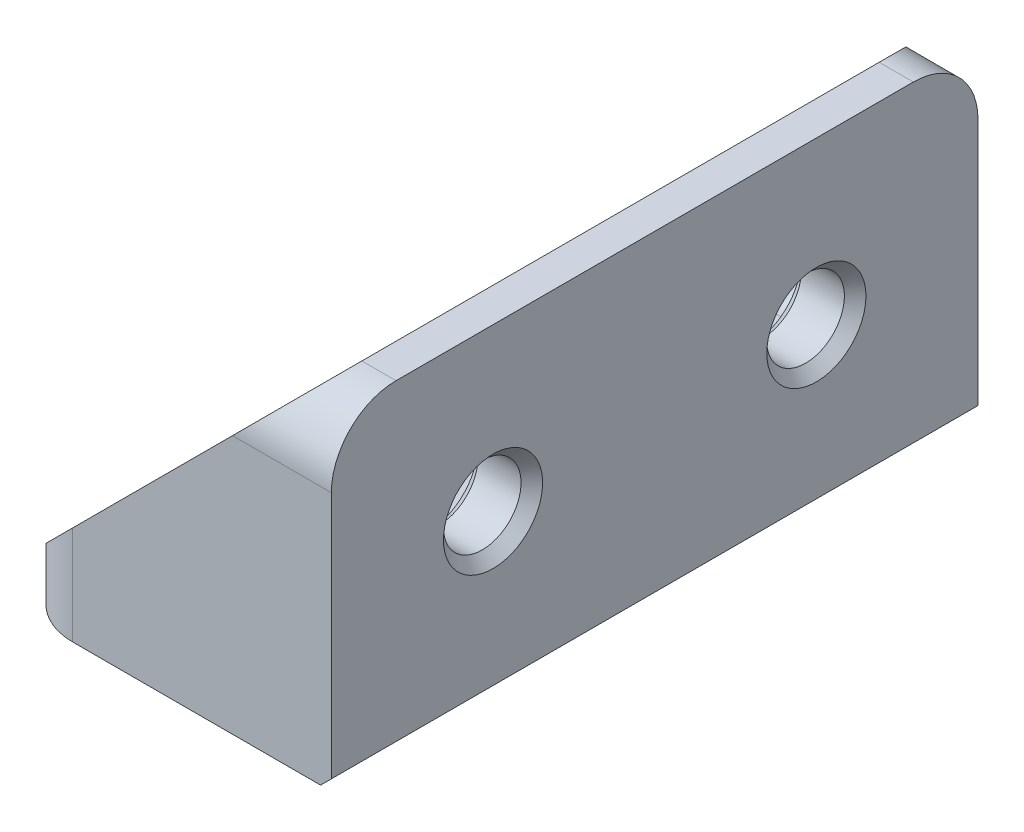
ISO-10303-21;
HEADER;
FILE_DESCRIPTION(('STEP AP214'),'2;1');
FILE_NAME('part.step','',(''),(''),'','','');
FILE_SCHEMA(('AUTOMOTIVE_DESIGN { 1 0 10303 214 1 1 1 1 }'));
ENDSEC;
DATA;
#1=APPLICATION_CONTEXT('core data for automotive mechanical design processes');
#2=APPLICATION_PROTOCOL_DEFINITION('international standard','automotive_design',2000,#1);
#3=PRODUCT_CONTEXT('',#1,'mechanical');
#4=PRODUCT('Part','Part','',(#3));
#5=PRODUCT_RELATED_PRODUCT_CATEGORY('part','',(#4));
#6=PRODUCT_DEFINITION_FORMATION('','',#4);
#7=PRODUCT_DEFINITION_CONTEXT('part definition',#1,'design');
#8=PRODUCT_DEFINITION('design','',#6,#7);
#9=PRODUCT_DEFINITION_SHAPE('','',#8);
#10=(LENGTH_UNIT() NAMED_UNIT(*) SI_UNIT(.MILLI.,.METRE.));
#11=(NAMED_UNIT(*) PLANE_ANGLE_UNIT() SI_UNIT($,.RADIAN.));
#12=(NAMED_UNIT(*) SI_UNIT($,.STERADIAN.) SOLID_ANGLE_UNIT());
#13=UNCERTAINTY_MEASURE_WITH_UNIT(LENGTH_MEASURE(1.E-05),#10,'distance_accuracy_value','');
#14=(GEOMETRIC_REPRESENTATION_CONTEXT(3) GLOBAL_UNCERTAINTY_ASSIGNED_CONTEXT((#13)) GLOBAL_UNIT_ASSIGNED_CONTEXT((#10,
#11,#12)) REPRESENTATION_CONTEXT('',''));
#15=CARTESIAN_POINT('',(0.,0.,0.));
#16=DIRECTION('',(0.,0.,1.));
#17=DIRECTION('',(1.,0.,0.));
#18=AXIS2_PLACEMENT_3D('',#15,#16,#17);
#19=CARTESIAN_POINT('',(-15.,0.,30.));
#20=DIRECTION('',(0.,1.,0.));
#21=DIRECTION('',(0.,0.,1.));
#22=AXIS2_PLACEMENT_3D('',#19,#20,#21);
#23=PLANE('',#22);
#24=CARTESIAN_POINT('',(-10.,0.,15.));
#25=DIRECTION('',(0.,1.,0.));
#26=DIRECTION('',(0.,0.,1.));
#27=AXIS2_PLACEMENT_3D('',#24,#25,#26);
#28=CIRCLE('',#27,2.49999999999999);
#29=CARTESIAN_POINT('',(-10.,0.,17.5));
#30=VERTEX_POINT('',#29);
#31=EDGE_CURVE('E197',#30,#30,#28,.T.);
#32=ORIENTED_EDGE('',*,*,#31,.T.);
#33=EDGE_LOOP('',(#32));
#34=FACE_BOUND('',#33,.T.);
#35=DIRECTION('',(1.,0.,0.));
#36=VECTOR('',#35,1.);
#37=CARTESIAN_POINT('',(-15.,0.,0.));
#38=LINE('',#37,#36);
#39=CARTESIAN_POINT('',(-12.,0.,0.));
#40=VERTEX_POINT('',#39);
#41=CARTESIAN_POINT('',(-0.500000000000004,0.,0.));
#42=VERTEX_POINT('',#41);
#43=EDGE_CURVE('E438',#40,#42,#38,.T.);
#44=ORIENTED_EDGE('',*,*,#43,.T.);
#45=DIRECTION('',(0.,0.,1.));
#46=VECTOR('',#45,1.);
#47=CARTESIAN_POINT('',(-0.500000000000004,0.,30.));
#48=LINE('',#47,#46);
#49=CARTESIAN_POINT('',(-0.500000000000004,0.,30.));
#50=VERTEX_POINT('',#49);
#51=EDGE_CURVE('E50',#42,#50,#48,.T.);
#52=ORIENTED_EDGE('',*,*,#51,.T.);
#53=DIRECTION('',(1.,0.,0.));
#54=VECTOR('',#53,1.);
#55=CARTESIAN_POINT('',(-15.,0.,30.));
#56=LINE('',#55,#54);
#57=CARTESIAN_POINT('',(-12.,0.,30.));
#58=VERTEX_POINT('',#57);
#59=EDGE_CURVE('E391',#58,#50,#56,.T.);
#60=ORIENTED_EDGE('',*,*,#59,.F.);
#61=CARTESIAN_POINT('',(-12.,0.,27.));
#62=DIRECTION('',(0.,1.,0.));
#63=DIRECTION('',(0.,0.,1.));
#64=AXIS2_PLACEMENT_3D('',#61,#62,#63);
#65=CIRCLE('',#64,3.);
#66=CARTESIAN_POINT('',(-15.,0.,27.));
#67=VERTEX_POINT('',#66);
#68=EDGE_CURVE('E377',#58,#67,#65,.F.);
#69=ORIENTED_EDGE('',*,*,#68,.T.);
#70=DIRECTION('',(0.,0.,-1.));
#71=VECTOR('',#70,1.);
#72=CARTESIAN_POINT('',(-15.,0.,30.));
#73=LINE('',#72,#71);
#74=CARTESIAN_POINT('',(-15.,0.,3.));
#75=VERTEX_POINT('',#74);
#76=EDGE_CURVE('E383',#67,#75,#73,.T.);
#77=ORIENTED_EDGE('',*,*,#76,.T.);
#78=CARTESIAN_POINT('',(-12.,0.,3.));
#79=DIRECTION('',(0.,1.,0.));
#80=DIRECTION('',(0.,0.,1.));
#81=AXIS2_PLACEMENT_3D('',#78,#79,#80);
#82=CIRCLE('',#81,3.);
#83=EDGE_CURVE('E375',#75,#40,#82,.F.);
#84=ORIENTED_EDGE('',*,*,#83,.T.);
#85=EDGE_LOOP('',(#44,#52,#60,#69,#77,#84));
#86=FACE_BOUND('',#85,.T.);
#87=ADVANCED_FACE('F35',(#34,#86),#23,.F.);
#88=CARTESIAN_POINT('',(0.,0.,30.));
#89=DIRECTION('',(-1.,0.,0.));
#90=DIRECTION('',(0.,0.,1.));
#91=AXIS2_PLACEMENT_3D('',#88,#89,#90);
#92=PLANE('',#91);
#93=CARTESIAN_POINT('',(0.,7.5,7.5));
#94=DIRECTION('',(-1.,0.,0.));
#95=DIRECTION('',(0.,0.,1.));
#96=AXIS2_PLACEMENT_3D('',#93,#94,#95);
#97=CIRCLE('',#96,2.30000000000001);
#98=CARTESIAN_POINT('',(0.,7.5,9.80000000000001));
#99=VERTEX_POINT('',#98);
#100=EDGE_CURVE('E190',#99,#99,#97,.T.);
#101=ORIENTED_EDGE('',*,*,#100,.T.);
#102=EDGE_LOOP('',(#101));
#103=FACE_BOUND('',#102,.T.);
#104=CARTESIAN_POINT('',(0.,7.5,22.5));
#105=DIRECTION('',(-1.,0.,0.));
#106=DIRECTION('',(0.,0.,1.));
#107=AXIS2_PLACEMENT_3D('',#104,#105,#106);
#108=CIRCLE('',#107,2.3);
#109=CARTESIAN_POINT('',(0.,7.5,24.8));
#110=VERTEX_POINT('',#109);
#111=EDGE_CURVE('E167',#110,#110,#108,.T.);
#112=ORIENTED_EDGE('',*,*,#111,.T.);
#113=EDGE_LOOP('',(#112));
#114=FACE_BOUND('',#113,.T.);
#115=DIRECTION('',(0.,1.,0.));
#116=VECTOR('',#115,1.);
#117=CARTESIAN_POINT('',(0.,0.,30.));
#118=LINE('',#117,#116);
#119=CARTESIAN_POINT('',(0.,0.500000000000004,30.));
#120=VERTEX_POINT('',#119);
#121=CARTESIAN_POINT('',(0.,12.,30.));
#122=VERTEX_POINT('',#121);
#123=EDGE_CURVE('E387',#120,#122,#118,.T.);
#124=ORIENTED_EDGE('',*,*,#123,.F.);
#125=DIRECTION('',(0.,0.,-1.));
#126=VECTOR('',#125,1.);
#127=CARTESIAN_POINT('',(0.,0.500000000000004,30.));
#128=LINE('',#127,#126);
#129=CARTESIAN_POINT('',(0.,0.500000000000004,0.));
#130=VERTEX_POINT('',#129);
#131=EDGE_CURVE('E193',#120,#130,#128,.T.);
#132=ORIENTED_EDGE('',*,*,#131,.T.);
#133=DIRECTION('',(0.,1.,0.));
#134=VECTOR('',#133,1.);
#135=CARTESIAN_POINT('',(0.,0.,0.));
#136=LINE('',#135,#134);
#137=CARTESIAN_POINT('',(0.,12.,0.));
#138=VERTEX_POINT('',#137);
#139=EDGE_CURVE('E394',#130,#138,#136,.T.);
#140=ORIENTED_EDGE('',*,*,#139,.T.);
#141=CARTESIAN_POINT('',(0.,12.,3.));
#142=DIRECTION('',(-1.,0.,0.));
#143=DIRECTION('',(0.,0.,1.));
#144=AXIS2_PLACEMENT_3D('',#141,#142,#143);
#145=CIRCLE('',#144,3.);
#146=CARTESIAN_POINT('',(0.,15.,3.));
#147=VERTEX_POINT('',#146);
#148=EDGE_CURVE('E179',#138,#147,#145,.F.);
#149=ORIENTED_EDGE('',*,*,#148,.T.);
#150=DIRECTION('',(0.,0.,-1.));
#151=VECTOR('',#150,1.);
#152=CARTESIAN_POINT('',(0.,15.,30.));
#153=LINE('',#152,#151);
#154=CARTESIAN_POINT('',(0.,15.,27.));
#155=VERTEX_POINT('',#154);
#156=EDGE_CURVE('E361',#155,#147,#153,.T.);
#157=ORIENTED_EDGE('',*,*,#156,.F.);
#158=CARTESIAN_POINT('',(0.,12.,27.));
#159=DIRECTION('',(-1.,0.,0.));
#160=DIRECTION('',(0.,0.,1.));
#161=AXIS2_PLACEMENT_3D('',#158,#159,#160);
#162=CIRCLE('',#161,3.);
#163=EDGE_CURVE('E372',#155,#122,#162,.F.);
#164=ORIENTED_EDGE('',*,*,#163,.T.);
#165=EDGE_LOOP('',(#124,#132,#140,#149,#157,#164));
#166=FACE_BOUND('',#165,.T.);
#167=ADVANCED_FACE('F253',(#103,#114,#166),#92,.F.);
#168=CARTESIAN_POINT('',(0.,15.,30.));
#169=DIRECTION('',(0.,-1.,0.));
#170=DIRECTION('',(0.,0.,-1.));
#171=AXIS2_PLACEMENT_3D('',#168,#169,#170);
#172=PLANE('',#171);
#173=DIRECTION('',(-1.,0.,0.));
#174=VECTOR('',#173,1.);
#175=CARTESIAN_POINT('',(0.,15.,3.));
#176=LINE('',#175,#174);
#177=CARTESIAN_POINT('',(-1.58578643762701,15.,3.));
#178=VERTEX_POINT('',#177);
#179=EDGE_CURVE('E358',#147,#178,#176,.T.);
#180=ORIENTED_EDGE('',*,*,#179,.T.);
#181=DIRECTION('',(0.,0.,1.));
#182=VECTOR('',#181,1.);
#183=CARTESIAN_POINT('',(-1.58578643762701,15.,30.));
#184=LINE('',#183,#182);
#185=CARTESIAN_POINT('',(-1.58578643762701,15.,27.));
#186=VERTEX_POINT('',#185);
#187=EDGE_CURVE('E162',#178,#186,#184,.T.);
#188=ORIENTED_EDGE('',*,*,#187,.T.);
#189=DIRECTION('',(-1.,0.,0.));
#190=VECTOR('',#189,1.);
#191=CARTESIAN_POINT('',(0.,15.,27.));
#192=LINE('',#191,#190);
#193=EDGE_CURVE('E362',#186,#155,#192,.F.);
#194=ORIENTED_EDGE('',*,*,#193,.T.);
#195=ORIENTED_EDGE('',*,*,#156,.T.);
#196=EDGE_LOOP('',(#180,#188,#194,#195));
#197=FACE_BOUND('',#196,.T.);
#198=ADVANCED_FACE('F259',(#197),#172,.F.);
#199=CARTESIAN_POINT('',(-15.,3.,30.));
#200=DIRECTION('',(1.,0.,0.));
#201=DIRECTION('',(0.,0.,-1.));
#202=AXIS2_PLACEMENT_3D('',#199,#200,#201);
#203=PLANE('',#202);
#204=DIRECTION('',(0.,-1.,0.));
#205=VECTOR('',#204,1.);
#206=CARTESIAN_POINT('',(-15.,3.,27.));
#207=LINE('',#206,#205);
#208=CARTESIAN_POINT('',(-15.,1.58578643762701,27.));
#209=VERTEX_POINT('',#208);
#210=EDGE_CURVE('E180',#67,#209,#207,.F.);
#211=ORIENTED_EDGE('',*,*,#210,.T.);
#212=DIRECTION('',(0.,0.,-1.));
#213=VECTOR('',#212,1.);
#214=CARTESIAN_POINT('',(-15.,1.58578643762701,30.));
#215=LINE('',#214,#213);
#216=CARTESIAN_POINT('',(-15.,1.58578643762701,3.));
#217=VERTEX_POINT('',#216);
#218=EDGE_CURVE('E385',#209,#217,#215,.T.);
#219=ORIENTED_EDGE('',*,*,#218,.T.);
#220=DIRECTION('',(0.,-1.,0.));
#221=VECTOR('',#220,1.);
#222=CARTESIAN_POINT('',(-15.,3.,3.));
#223=LINE('',#222,#221);
#224=EDGE_CURVE('E184',#217,#75,#223,.T.);
#225=ORIENTED_EDGE('',*,*,#224,.T.);
#226=ORIENTED_EDGE('',*,*,#76,.F.);
#227=EDGE_LOOP('',(#211,#219,#225,#226));
#228=FACE_BOUND('',#227,.T.);
#229=ADVANCED_FACE('F347',(#228),#203,.F.);
#230=CARTESIAN_POINT('',(0.,0.,30.));
#231=DIRECTION('',(0.,0.,1.));
#232=DIRECTION('',(1.,0.,0.));
#233=AXIS2_PLACEMENT_3D('',#230,#231,#232);
#234=PLANE('',#233);
#235=ORIENTED_EDGE('',*,*,#59,.T.);
#236=DIRECTION('',(-0.707106781186548,-0.707106781186548,0.));
#237=VECTOR('',#236,1.);
#238=CARTESIAN_POINT('',(-0.250000000000002,0.250000000000002,30.));
#239=LINE('',#238,#237);
#240=EDGE_CURVE('E201',#50,#120,#239,.F.);
#241=ORIENTED_EDGE('',*,*,#240,.T.);
#242=ORIENTED_EDGE('',*,*,#123,.T.);
#243=DIRECTION('',(-1.,0.,0.));
#244=VECTOR('',#243,1.);
#245=CARTESIAN_POINT('',(-3.00000000000013,12.,30.));
#246=LINE('',#245,#244);
#247=CARTESIAN_POINT('',(-4.58578643762701,12.,30.));
#248=VERTEX_POINT('',#247);
#249=EDGE_CURVE('E363',#122,#248,#246,.T.);
#250=ORIENTED_EDGE('',*,*,#249,.T.);
#251=DIRECTION('',(-0.707106781186548,-0.707106781186547,0.));
#252=VECTOR('',#251,1.);
#253=CARTESIAN_POINT('',(1.60403694223592,18.1898233798629,30.));
#254=LINE('',#253,#252);
#255=CARTESIAN_POINT('',(-12.,4.58578643762701,30.));
#256=VERTEX_POINT('',#255);
#257=EDGE_CURVE('E176',#248,#256,#254,.T.);
#258=ORIENTED_EDGE('',*,*,#257,.T.);
#259=DIRECTION('',(0.,-1.,0.));
#260=VECTOR('',#259,1.);
#261=CARTESIAN_POINT('',(-12.,0.,30.));
#262=LINE('',#261,#260);
#263=EDGE_CURVE('E367',#256,#58,#262,.T.);
#264=ORIENTED_EDGE('',*,*,#263,.T.);
#265=EDGE_LOOP('',(#235,#241,#242,#250,#258,#264));
#266=FACE_BOUND('',#265,.T.);
#267=ADVANCED_FACE('F343',(#266),#234,.T.);
#268=CARTESIAN_POINT('',(0.,0.,0.));
#269=DIRECTION('',(0.,0.,1.));
#270=DIRECTION('',(1.,0.,0.));
#271=AXIS2_PLACEMENT_3D('',#268,#269,#270);
#272=PLANE('',#271);
#273=ORIENTED_EDGE('',*,*,#139,.F.);
#274=DIRECTION('',(0.707106781186548,0.707106781186548,0.));
#275=VECTOR('',#274,1.);
#276=CARTESIAN_POINT('',(0.,0.500000000000004,0.));
#277=LINE('',#276,#275);
#278=EDGE_CURVE('E58',#130,#42,#277,.F.);
#279=ORIENTED_EDGE('',*,*,#278,.T.);
#280=ORIENTED_EDGE('',*,*,#43,.F.);
#281=DIRECTION('',(0.,-1.,0.));
#282=VECTOR('',#281,1.);
#283=CARTESIAN_POINT('',(-12.,0.,0.));
#284=LINE('',#283,#282);
#285=CARTESIAN_POINT('',(-12.,4.58578643762701,0.));
#286=VERTEX_POINT('',#285);
#287=EDGE_CURVE('E168',#40,#286,#284,.F.);
#288=ORIENTED_EDGE('',*,*,#287,.T.);
#289=DIRECTION('',(-0.707106781186548,-0.707106781186547,0.));
#290=VECTOR('',#289,1.);
#291=CARTESIAN_POINT('',(1.60403694223592,18.1898233798629,0.));
#292=LINE('',#291,#290);
#293=CARTESIAN_POINT('',(-4.58578643762701,12.,0.));
#294=VERTEX_POINT('',#293);
#295=EDGE_CURVE('E159',#294,#286,#292,.T.);
#296=ORIENTED_EDGE('',*,*,#295,.F.);
#297=DIRECTION('',(-1.,0.,0.));
#298=VECTOR('',#297,1.);
#299=CARTESIAN_POINT('',(0.,12.,0.));
#300=LINE('',#299,#298);
#301=EDGE_CURVE('E173',#294,#138,#300,.F.);
#302=ORIENTED_EDGE('',*,*,#301,.T.);
#303=EDGE_LOOP('',(#273,#279,#280,#288,#296,#302));
#304=FACE_BOUND('',#303,.T.);
#305=ADVANCED_FACE('F172',(#304),#272,.F.);
#306=CARTESIAN_POINT('',(-3.00000000000013,3.,2.5));
#307=DIRECTION('',(1.,0.,0.));
#308=DIRECTION('',(0.,0.,-1.));
#309=AXIS2_PLACEMENT_3D('',#306,#307,#308);
#310=PLANE('',#309);
#311=CARTESIAN_POINT('',(-3.00000000000013,7.5,22.5));
#312=DIRECTION('',(1.,0.,0.));
#313=DIRECTION('',(0.,0.,-1.));
#314=AXIS2_PLACEMENT_3D('',#311,#312,#313);
#315=CIRCLE('',#314,2.3);
#316=CARTESIAN_POINT('',(-3.00000000000013,7.5,20.2));
#317=VERTEX_POINT('',#316);
#318=EDGE_CURVE('E11',#317,#317,#315,.T.);
#319=ORIENTED_EDGE('',*,*,#318,.T.);
#320=EDGE_LOOP('',(#319));
#321=FACE_BOUND('',#320,.T.);
#322=CARTESIAN_POINT('',(-3.00000000000013,7.5,7.5));
#323=DIRECTION('',(1.,0.,0.));
#324=DIRECTION('',(0.,0.,-1.));
#325=AXIS2_PLACEMENT_3D('',#322,#323,#324);
#326=CIRCLE('',#325,2.3);
#327=CARTESIAN_POINT('',(-3.00000000000013,7.5,5.2));
#328=VERTEX_POINT('',#327);
#329=EDGE_CURVE('E43',#328,#328,#326,.T.);
#330=ORIENTED_EDGE('',*,*,#329,.T.);
#331=EDGE_LOOP('',(#330));
#332=FACE_BOUND('',#331,.T.);
#333=DIRECTION('',(0.,1.,0.));
#334=VECTOR('',#333,1.);
#335=CARTESIAN_POINT('',(-3.00000000000013,15.,26.5));
#336=LINE('',#335,#334);
#337=CARTESIAN_POINT('',(-3.00000000000013,4.,26.5));
#338=VERTEX_POINT('',#337);
#339=CARTESIAN_POINT('',(-3.00000000000013,13.5857864376269,26.5));
#340=VERTEX_POINT('',#339);
#341=EDGE_CURVE('E412',#338,#340,#336,.T.);
#342=ORIENTED_EDGE('',*,*,#341,.T.);
#343=DIRECTION('',(0.,0.,-1.));
#344=VECTOR('',#343,1.);
#345=CARTESIAN_POINT('',(-3.00000000000013,13.5857864376269,2.5));
#346=LINE('',#345,#344);
#347=CARTESIAN_POINT('',(-3.00000000000013,13.5857864376269,3.5));
#348=VERTEX_POINT('',#347);
#349=EDGE_CURVE('E477',#340,#348,#346,.T.);
#350=ORIENTED_EDGE('',*,*,#349,.T.);
#351=DIRECTION('',(0.,1.,0.));
#352=VECTOR('',#351,1.);
#353=CARTESIAN_POINT('',(-3.00000000000013,3.,3.5));
#354=LINE('',#353,#352);
#355=CARTESIAN_POINT('',(-3.00000000000013,4.,3.5));
#356=VERTEX_POINT('',#355);
#357=EDGE_CURVE('E408',#348,#356,#354,.F.);
#358=ORIENTED_EDGE('',*,*,#357,.T.);
#359=DIRECTION('',(0.,0.,1.));
#360=VECTOR('',#359,1.);
#361=CARTESIAN_POINT('',(-3.00000000000013,4.,27.5));
#362=LINE('',#361,#360);
#363=EDGE_CURVE('E410',#356,#338,#362,.T.);
#364=ORIENTED_EDGE('',*,*,#363,.T.);
#365=EDGE_LOOP('',(#342,#350,#358,#364));
#366=FACE_BOUND('',#365,.T.);
#367=ADVANCED_FACE('F226',(#321,#332,#366),#310,.F.);
#368=CARTESIAN_POINT('',(-15.,3.,2.5));
#369=DIRECTION('',(0.,-1.,0.));
#370=DIRECTION('',(0.,0.,-1.));
#371=AXIS2_PLACEMENT_3D('',#368,#369,#370);
#372=PLANE('',#371);
#373=CARTESIAN_POINT('',(-10.,3.,15.));
#374=DIRECTION('',(0.,-1.,0.));
#375=DIRECTION('',(0.,0.,-1.));
#376=AXIS2_PLACEMENT_3D('',#373,#374,#375);
#377=CIRCLE('',#376,2.5);
#378=CARTESIAN_POINT('',(-10.,3.,12.5));
#379=VERTEX_POINT('',#378);
#380=EDGE_CURVE('E221',#379,#379,#377,.T.);
#381=ORIENTED_EDGE('',*,*,#380,.T.);
#382=EDGE_LOOP('',(#381));
#383=FACE_BOUND('',#382,.T.);
#384=DIRECTION('',(1.,0.,0.));
#385=VECTOR('',#384,1.);
#386=CARTESIAN_POINT('',(-15.,3.,3.5));
#387=LINE('',#386,#385);
#388=CARTESIAN_POINT('',(-4.00000000000013,3.,3.5));
#389=VERTEX_POINT('',#388);
#390=CARTESIAN_POINT('',(-13.585786437627,3.,3.5));
#391=VERTEX_POINT('',#390);
#392=EDGE_CURVE('E389',#389,#391,#387,.F.);
#393=ORIENTED_EDGE('',*,*,#392,.T.);
#394=DIRECTION('',(0.,0.,1.));
#395=VECTOR('',#394,1.);
#396=CARTESIAN_POINT('',(-13.585786437627,3.,2.5));
#397=LINE('',#396,#395);
#398=CARTESIAN_POINT('',(-13.585786437627,3.,26.5));
#399=VERTEX_POINT('',#398);
#400=EDGE_CURVE('E467',#391,#399,#397,.T.);
#401=ORIENTED_EDGE('',*,*,#400,.T.);
#402=DIRECTION('',(1.,0.,0.));
#403=VECTOR('',#402,1.);
#404=CARTESIAN_POINT('',(-3.00000000000013,3.,26.5));
#405=LINE('',#404,#403);
#406=CARTESIAN_POINT('',(-4.00000000000013,3.,26.5));
#407=VERTEX_POINT('',#406);
#408=EDGE_CURVE('E401',#399,#407,#405,.T.);
#409=ORIENTED_EDGE('',*,*,#408,.T.);
#410=DIRECTION('',(0.,0.,1.));
#411=VECTOR('',#410,1.);
#412=CARTESIAN_POINT('',(-4.00000000000013,3.,2.5));
#413=LINE('',#412,#411);
#414=EDGE_CURVE('E399',#407,#389,#413,.F.);
#415=ORIENTED_EDGE('',*,*,#414,.T.);
#416=EDGE_LOOP('',(#393,#401,#409,#415));
#417=FACE_BOUND('',#416,.T.);
#418=ADVANCED_FACE('F335',(#383,#417),#372,.F.);
#419=CARTESIAN_POINT('',(0.,0.,2.5));
#420=DIRECTION('',(0.,0.,1.));
#421=DIRECTION('',(1.,0.,0.));
#422=AXIS2_PLACEMENT_3D('',#419,#420,#421);
#423=PLANE('',#422);
#424=DIRECTION('',(0.707106781186548,0.707106781186547,0.));
#425=VECTOR('',#424,1.);
#426=CARTESIAN_POINT('',(-8.2928932188135,8.29289321881351,2.5));
#427=LINE('',#426,#425);
#428=CARTESIAN_POINT('',(-12.585786437627,4.,2.5));
#429=VERTEX_POINT('',#428);
#430=CARTESIAN_POINT('',(-4.00000000000013,12.5857864376269,2.5));
#431=VERTEX_POINT('',#430);
#432=EDGE_CURVE('E476',#429,#431,#427,.T.);
#433=ORIENTED_EDGE('',*,*,#432,.F.);
#434=DIRECTION('',(1.,0.,0.));
#435=VECTOR('',#434,1.);
#436=CARTESIAN_POINT('',(0.,4.,2.5));
#437=LINE('',#436,#435);
#438=CARTESIAN_POINT('',(-4.00000000000013,4.,2.5));
#439=VERTEX_POINT('',#438);
#440=EDGE_CURVE('E418',#429,#439,#437,.T.);
#441=ORIENTED_EDGE('',*,*,#440,.T.);
#442=DIRECTION('',(0.,1.,0.));
#443=VECTOR('',#442,1.);
#444=CARTESIAN_POINT('',(-4.00000000000013,0.,2.5));
#445=LINE('',#444,#443);
#446=EDGE_CURVE('E415',#439,#431,#445,.T.);
#447=ORIENTED_EDGE('',*,*,#446,.T.);
#448=EDGE_LOOP('',(#433,#441,#447));
#449=FACE_BOUND('',#448,.T.);
#450=ADVANCED_FACE('F248',(#449),#423,.T.);
#451=CARTESIAN_POINT('',(0.,0.,27.5));
#452=DIRECTION('',(0.,0.,1.));
#453=DIRECTION('',(1.,0.,0.));
#454=AXIS2_PLACEMENT_3D('',#451,#452,#453);
#455=PLANE('',#454);
#456=DIRECTION('',(1.,0.,0.));
#457=VECTOR('',#456,1.);
#458=CARTESIAN_POINT('',(-15.,4.,27.5));
#459=LINE('',#458,#457);
#460=CARTESIAN_POINT('',(-4.00000000000013,4.,27.5));
#461=VERTEX_POINT('',#460);
#462=CARTESIAN_POINT('',(-12.585786437627,4.,27.5));
#463=VERTEX_POINT('',#462);
#464=EDGE_CURVE('E405',#461,#463,#459,.F.);
#465=ORIENTED_EDGE('',*,*,#464,.T.);
#466=DIRECTION('',(0.707106781186548,0.707106781186547,0.));
#467=VECTOR('',#466,1.);
#468=CARTESIAN_POINT('',(-8.2928932188135,8.29289321881351,27.5));
#469=LINE('',#468,#467);
#470=CARTESIAN_POINT('',(-4.00000000000013,12.5857864376269,27.5));
#471=VERTEX_POINT('',#470);
#472=EDGE_CURVE('E464',#463,#471,#469,.T.);
#473=ORIENTED_EDGE('',*,*,#472,.T.);
#474=DIRECTION('',(0.,1.,0.));
#475=VECTOR('',#474,1.);
#476=CARTESIAN_POINT('',(-4.00000000000013,3.,27.5));
#477=LINE('',#476,#475);
#478=EDGE_CURVE('E403',#471,#461,#477,.F.);
#479=ORIENTED_EDGE('',*,*,#478,.T.);
#480=EDGE_LOOP('',(#465,#473,#479));
#481=FACE_BOUND('',#480,.T.);
#482=ADVANCED_FACE('F237',(#481),#455,.F.);
#483=CARTESIAN_POINT('',(21.9999999999999,7.5,7.5));
#484=DIRECTION('',(-1.,0.,0.));
#485=DIRECTION('',(0.,0.,1.));
#486=AXIS2_PLACEMENT_3D('',#483,#484,#485);
#487=CYLINDRICAL_SURFACE('',#486,1.8);
#488=CARTESIAN_POINT('',(-0.500000000000007,7.5,7.5));
#489=DIRECTION('',(-1.,0.,0.));
#490=DIRECTION('',(0.,0.,1.));
#491=AXIS2_PLACEMENT_3D('',#488,#489,#490);
#492=CIRCLE('',#491,1.8);
#493=CARTESIAN_POINT('',(-0.500000000000007,7.5,9.3));
#494=VERTEX_POINT('',#493);
#495=EDGE_CURVE('E212',#494,#494,#492,.F.);
#496=ORIENTED_EDGE('',*,*,#495,.T.);
#497=EDGE_LOOP('',(#496));
#498=FACE_BOUND('',#497,.T.);
#499=CARTESIAN_POINT('',(-2.50000000000013,7.5,7.5));
#500=DIRECTION('',(1.,0.,0.));
#501=DIRECTION('',(0.,0.,-1.));
#502=AXIS2_PLACEMENT_3D('',#499,#500,#501);
#503=CIRCLE('',#502,1.8);
#504=CARTESIAN_POINT('',(-2.50000000000013,7.5,5.7));
#505=VERTEX_POINT('',#504);
#506=EDGE_CURVE('E209',#505,#505,#503,.F.);
#507=ORIENTED_EDGE('',*,*,#506,.T.);
#508=EDGE_LOOP('',(#507));
#509=FACE_BOUND('',#508,.T.);
#510=ADVANCED_FACE('F234',(#498,#509),#487,.F.);
#511=CARTESIAN_POINT('',(21.9999999999999,7.5,22.5));
#512=DIRECTION('',(-1.,0.,0.));
#513=DIRECTION('',(0.,0.,1.));
#514=AXIS2_PLACEMENT_3D('',#511,#512,#513);
#515=CYLINDRICAL_SURFACE('',#514,1.8);
#516=CARTESIAN_POINT('',(-0.5,7.5,22.5));
#517=DIRECTION('',(-1.,0.,0.));
#518=DIRECTION('',(0.,0.,1.));
#519=AXIS2_PLACEMENT_3D('',#516,#517,#518);
#520=CIRCLE('',#519,1.8);
#521=CARTESIAN_POINT('',(-0.5,7.5,24.3));
#522=VERTEX_POINT('',#521);
#523=EDGE_CURVE('E218',#522,#522,#520,.F.);
#524=ORIENTED_EDGE('',*,*,#523,.T.);
#525=EDGE_LOOP('',(#524));
#526=FACE_BOUND('',#525,.T.);
#527=CARTESIAN_POINT('',(-2.50000000000014,7.5,22.5));
#528=DIRECTION('',(1.,0.,0.));
#529=DIRECTION('',(0.,0.,-1.));
#530=AXIS2_PLACEMENT_3D('',#527,#528,#529);
#531=CIRCLE('',#530,1.8);
#532=CARTESIAN_POINT('',(-2.50000000000014,7.5,20.7));
#533=VERTEX_POINT('',#532);
#534=EDGE_CURVE('E215',#533,#533,#531,.F.);
#535=ORIENTED_EDGE('',*,*,#534,.T.);
#536=EDGE_LOOP('',(#535));
#537=FACE_BOUND('',#536,.T.);
#538=ADVANCED_FACE('F236',(#526,#537),#515,.F.);
#539=CARTESIAN_POINT('',(0.,4.,3.5));
#540=DIRECTION('',(1.,0.,0.));
#541=DIRECTION('',(0.,0.,-1.));
#542=AXIS2_PLACEMENT_3D('',#539,#540,#541);
#543=CYLINDRICAL_SURFACE('',#542,1.);
#544=ORIENTED_EDGE('',*,*,#440,.F.);
#545=CARTESIAN_POINT('',(-12.585786437627,4.,3.5));
#546=DIRECTION('',(0.707106781186547,-0.707106781186548,0.));
#547=DIRECTION('',(0.707106781186548,0.707106781186547,0.));
#548=AXIS2_PLACEMENT_3D('',#545,#546,#547);
#549=ELLIPSE('',#548,1.4142135623731,1.);
#550=EDGE_CURVE('E473',#429,#391,#549,.F.);
#551=ORIENTED_EDGE('',*,*,#550,.T.);
#552=ORIENTED_EDGE('',*,*,#392,.F.);
#553=CARTESIAN_POINT('',(-4.00000000000013,4.,3.5));
#554=DIRECTION('',(-1.,0.,0.));
#555=DIRECTION('',(0.,0.,1.));
#556=AXIS2_PLACEMENT_3D('',#553,#554,#555);
#557=CIRCLE('',#556,1.);
#558=EDGE_CURVE('E436',#439,#389,#557,.T.);
#559=ORIENTED_EDGE('',*,*,#558,.F.);
#560=EDGE_LOOP('',(#544,#551,#552,#559));
#561=FACE_BOUND('',#560,.T.);
#562=ADVANCED_FACE('F244',(#561),#543,.F.);
#563=CARTESIAN_POINT('',(-4.00000000000013,0.,3.5));
#564=DIRECTION('',(0.,1.,0.));
#565=DIRECTION('',(0.,0.,1.));
#566=AXIS2_PLACEMENT_3D('',#563,#564,#565);
#567=CYLINDRICAL_SURFACE('',#566,1.);
#568=ORIENTED_EDGE('',*,*,#357,.F.);
#569=CARTESIAN_POINT('',(-4.00000000000013,12.5857864376269,3.5));
#570=DIRECTION('',(0.707106781186547,-0.707106781186548,0.));
#571=DIRECTION('',(0.707106781186548,0.707106781186547,0.));
#572=AXIS2_PLACEMENT_3D('',#569,#570,#571);
#573=ELLIPSE('',#572,1.41421356237309,1.);
#574=EDGE_CURVE('E424',#348,#431,#573,.F.);
#575=ORIENTED_EDGE('',*,*,#574,.T.);
#576=ORIENTED_EDGE('',*,*,#446,.F.);
#577=CARTESIAN_POINT('',(-4.00000000000013,4.,3.5));
#578=DIRECTION('',(0.,1.,0.));
#579=DIRECTION('',(0.,0.,1.));
#580=AXIS2_PLACEMENT_3D('',#577,#578,#579);
#581=CIRCLE('',#580,1.);
#582=EDGE_CURVE('E433',#356,#439,#581,.T.);
#583=ORIENTED_EDGE('',*,*,#582,.F.);
#584=EDGE_LOOP('',(#568,#575,#576,#583));
#585=FACE_BOUND('',#584,.T.);
#586=ADVANCED_FACE('F284',(#585),#567,.F.);
#587=CARTESIAN_POINT('',(-4.00000000000013,4.,3.5));
#588=DIRECTION('',(0.,0.,1.));
#589=DIRECTION('',(1.,0.,0.));
#590=AXIS2_PLACEMENT_3D('',#587,#588,#589);
#591=SPHERICAL_SURFACE('',#590,1.);
#592=ORIENTED_EDGE('',*,*,#582,.T.);
#593=ORIENTED_EDGE('',*,*,#558,.T.);
#594=CARTESIAN_POINT('',(-4.00000000000013,4.,3.5));
#595=DIRECTION('',(0.,0.,1.));
#596=DIRECTION('',(1.,0.,0.));
#597=AXIS2_PLACEMENT_3D('',#594,#595,#596);
#598=CIRCLE('',#597,1.);
#599=EDGE_CURVE('E430',#356,#389,#598,.F.);
#600=ORIENTED_EDGE('',*,*,#599,.F.);
#601=EDGE_LOOP('',(#592,#593,#600));
#602=FACE_BOUND('',#601,.T.);
#603=ADVANCED_FACE('F280',(#602),#591,.F.);
#604=CARTESIAN_POINT('',(-4.00000000000013,4.,2.5));
#605=DIRECTION('',(0.,0.,-1.));
#606=DIRECTION('',(-1.,0.,0.));
#607=AXIS2_PLACEMENT_3D('',#604,#605,#606);
#608=CYLINDRICAL_SURFACE('',#607,1.);
#609=ORIENTED_EDGE('',*,*,#599,.T.);
#610=ORIENTED_EDGE('',*,*,#414,.F.);
#611=CARTESIAN_POINT('',(-4.00000000000013,4.,26.5));
#612=DIRECTION('',(0.,0.,-1.));
#613=DIRECTION('',(-1.,0.,0.));
#614=AXIS2_PLACEMENT_3D('',#611,#612,#613);
#615=CIRCLE('',#614,1.);
#616=EDGE_CURVE('E427',#338,#407,#615,.T.);
#617=ORIENTED_EDGE('',*,*,#616,.F.);
#618=ORIENTED_EDGE('',*,*,#363,.F.);
#619=EDGE_LOOP('',(#609,#610,#617,#618));
#620=FACE_BOUND('',#619,.T.);
#621=ADVANCED_FACE('F276',(#620),#608,.F.);
#622=CARTESIAN_POINT('',(-4.00000000000013,3.,26.5));
#623=DIRECTION('',(0.,-1.,0.));
#624=DIRECTION('',(0.,0.,-1.));
#625=AXIS2_PLACEMENT_3D('',#622,#623,#624);
#626=CYLINDRICAL_SURFACE('',#625,1.);
#627=ORIENTED_EDGE('',*,*,#478,.F.);
#628=CARTESIAN_POINT('',(-4.00000000000013,12.5857864376269,26.5));
#629=DIRECTION('',(0.707106781186547,-0.707106781186548,0.));
#630=DIRECTION('',(-0.707106781186548,-0.707106781186547,0.));
#631=AXIS2_PLACEMENT_3D('',#628,#629,#630);
#632=ELLIPSE('',#631,1.41421356237309,1.);
#633=EDGE_CURVE('E470',#471,#340,#632,.F.);
#634=ORIENTED_EDGE('',*,*,#633,.T.);
#635=ORIENTED_EDGE('',*,*,#341,.F.);
#636=CARTESIAN_POINT('',(-4.00000000000013,4.,26.5));
#637=DIRECTION('',(0.,1.,0.));
#638=DIRECTION('',(0.,0.,1.));
#639=AXIS2_PLACEMENT_3D('',#636,#637,#638);
#640=CIRCLE('',#639,1.);
#641=EDGE_CURVE('E423',#461,#338,#640,.T.);
#642=ORIENTED_EDGE('',*,*,#641,.F.);
#643=EDGE_LOOP('',(#627,#634,#635,#642));
#644=FACE_BOUND('',#643,.T.);
#645=ADVANCED_FACE('F272',(#644),#626,.F.);
#646=CARTESIAN_POINT('',(-4.00000000000013,4.,26.5));
#647=DIRECTION('',(0.,0.,1.));
#648=DIRECTION('',(1.,0.,0.));
#649=AXIS2_PLACEMENT_3D('',#646,#647,#648);
#650=SPHERICAL_SURFACE('',#649,1.);
#651=ORIENTED_EDGE('',*,*,#641,.T.);
#652=ORIENTED_EDGE('',*,*,#616,.T.);
#653=CARTESIAN_POINT('',(-4.00000000000013,4.,26.5));
#654=DIRECTION('',(-1.,0.,0.));
#655=DIRECTION('',(0.,0.,1.));
#656=AXIS2_PLACEMENT_3D('',#653,#654,#655);
#657=CIRCLE('',#656,1.);
#658=EDGE_CURVE('E420',#461,#407,#657,.F.);
#659=ORIENTED_EDGE('',*,*,#658,.F.);
#660=EDGE_LOOP('',(#651,#652,#659));
#661=FACE_BOUND('',#660,.T.);
#662=ADVANCED_FACE('F268',(#661),#650,.F.);
#663=CARTESIAN_POINT('',(-15.,4.,26.5));
#664=DIRECTION('',(-1.,0.,0.));
#665=DIRECTION('',(0.,0.,1.));
#666=AXIS2_PLACEMENT_3D('',#663,#664,#665);
#667=CYLINDRICAL_SURFACE('',#666,1.);
#668=ORIENTED_EDGE('',*,*,#408,.F.);
#669=CARTESIAN_POINT('',(-12.585786437627,4.,26.5));
#670=DIRECTION('',(0.707106781186547,-0.707106781186548,0.));
#671=DIRECTION('',(-0.707106781186548,-0.707106781186547,0.));
#672=AXIS2_PLACEMENT_3D('',#669,#670,#671);
#673=ELLIPSE('',#672,1.4142135623731,1.);
#674=EDGE_CURVE('E461',#399,#463,#673,.F.);
#675=ORIENTED_EDGE('',*,*,#674,.T.);
#676=ORIENTED_EDGE('',*,*,#464,.F.);
#677=ORIENTED_EDGE('',*,*,#658,.T.);
#678=EDGE_LOOP('',(#668,#675,#676,#677));
#679=FACE_BOUND('',#678,.T.);
#680=ADVANCED_FACE('F264',(#679),#667,.F.);
#681=CARTESIAN_POINT('',(0.,12.,27.));
#682=DIRECTION('',(1.,0.,0.));
#683=DIRECTION('',(0.,0.,-1.));
#684=AXIS2_PLACEMENT_3D('',#681,#682,#683);
#685=CYLINDRICAL_SURFACE('',#684,3.);
#686=CARTESIAN_POINT('',(-4.58578643762701,12.,27.));
#687=DIRECTION('',(0.707106781186547,-0.707106781186548,0.));
#688=DIRECTION('',(0.707106781186548,0.707106781186547,0.));
#689=AXIS2_PLACEMENT_3D('',#686,#687,#688);
#690=ELLIPSE('',#689,4.24264068711929,3.);
#691=EDGE_CURVE('E452',#248,#186,#690,.F.);
#692=ORIENTED_EDGE('',*,*,#691,.F.);
#693=ORIENTED_EDGE('',*,*,#249,.F.);
#694=ORIENTED_EDGE('',*,*,#163,.F.);
#695=ORIENTED_EDGE('',*,*,#193,.F.);
#696=EDGE_LOOP('',(#692,#693,#694,#695));
#697=FACE_BOUND('',#696,.T.);
#698=ADVANCED_FACE('F267',(#697),#685,.T.);
#699=CARTESIAN_POINT('',(-12.,0.,27.));
#700=DIRECTION('',(0.,1.,0.));
#701=DIRECTION('',(0.,0.,1.));
#702=AXIS2_PLACEMENT_3D('',#699,#700,#701);
#703=CYLINDRICAL_SURFACE('',#702,3.);
#704=CARTESIAN_POINT('',(-12.,4.58578643762701,27.));
#705=DIRECTION('',(0.707106781186547,-0.707106781186548,0.));
#706=DIRECTION('',(0.707106781186548,0.707106781186547,0.));
#707=AXIS2_PLACEMENT_3D('',#704,#705,#706);
#708=ELLIPSE('',#707,4.24264068711928,3.);
#709=EDGE_CURVE('E459',#209,#256,#708,.F.);
#710=ORIENTED_EDGE('',*,*,#709,.F.);
#711=ORIENTED_EDGE('',*,*,#210,.F.);
#712=ORIENTED_EDGE('',*,*,#68,.F.);
#713=ORIENTED_EDGE('',*,*,#263,.F.);
#714=EDGE_LOOP('',(#710,#711,#712,#713));
#715=FACE_BOUND('',#714,.T.);
#716=ADVANCED_FACE('F294',(#715),#703,.T.);
#717=CARTESIAN_POINT('',(-12.,3.,3.));
#718=DIRECTION('',(0.,-1.,0.));
#719=DIRECTION('',(0.,0.,-1.));
#720=AXIS2_PLACEMENT_3D('',#717,#718,#719);
#721=CYLINDRICAL_SURFACE('',#720,3.);
#722=CARTESIAN_POINT('',(-12.,4.58578643762701,3.));
#723=DIRECTION('',(0.707106781186547,-0.707106781186548,0.));
#724=DIRECTION('',(-0.707106781186548,-0.707106781186547,0.));
#725=AXIS2_PLACEMENT_3D('',#722,#723,#724);
#726=ELLIPSE('',#725,4.24264068711928,3.);
#727=EDGE_CURVE('E453',#286,#217,#726,.F.);
#728=ORIENTED_EDGE('',*,*,#727,.F.);
#729=ORIENTED_EDGE('',*,*,#287,.F.);
#730=ORIENTED_EDGE('',*,*,#83,.F.);
#731=ORIENTED_EDGE('',*,*,#224,.F.);
#732=EDGE_LOOP('',(#728,#729,#730,#731));
#733=FACE_BOUND('',#732,.T.);
#734=ADVANCED_FACE('F298',(#733),#721,.T.);
#735=CARTESIAN_POINT('',(0.,12.,3.));
#736=DIRECTION('',(-1.,0.,0.));
#737=DIRECTION('',(0.,0.,1.));
#738=AXIS2_PLACEMENT_3D('',#735,#736,#737);
#739=CYLINDRICAL_SURFACE('',#738,3.);
#740=CARTESIAN_POINT('',(-4.58578643762701,12.,3.));
#741=DIRECTION('',(0.707106781186547,-0.707106781186548,0.));
#742=DIRECTION('',(-0.707106781186548,-0.707106781186547,0.));
#743=AXIS2_PLACEMENT_3D('',#740,#741,#742);
#744=ELLIPSE('',#743,4.24264068711929,3.);
#745=EDGE_CURVE('E155',#178,#294,#744,.F.);
#746=ORIENTED_EDGE('',*,*,#745,.F.);
#747=ORIENTED_EDGE('',*,*,#179,.F.);
#748=ORIENTED_EDGE('',*,*,#148,.F.);
#749=ORIENTED_EDGE('',*,*,#301,.F.);
#750=EDGE_LOOP('',(#746,#747,#748,#749));
#751=FACE_BOUND('',#750,.T.);
#752=ADVANCED_FACE('F178',(#751),#739,.T.);
#753=CARTESIAN_POINT('',(-10.,-22.,15.));
#754=DIRECTION('',(0.,1.,0.));
#755=DIRECTION('',(0.,0.,1.));
#756=AXIS2_PLACEMENT_3D('',#753,#754,#755);
#757=CYLINDRICAL_SURFACE('',#756,2.);
#758=CARTESIAN_POINT('',(-10.,0.499999999999997,15.));
#759=DIRECTION('',(0.,1.,0.));
#760=DIRECTION('',(0.,0.,1.));
#761=AXIS2_PLACEMENT_3D('',#758,#759,#760);
#762=CIRCLE('',#761,2.);
#763=CARTESIAN_POINT('',(-10.,0.499999999999997,17.));
#764=VERTEX_POINT('',#763);
#765=EDGE_CURVE('E206',#764,#764,#762,.F.);
#766=ORIENTED_EDGE('',*,*,#765,.T.);
#767=EDGE_LOOP('',(#766));
#768=FACE_BOUND('',#767,.T.);
#769=CARTESIAN_POINT('',(-10.,2.50000000000001,15.));
#770=DIRECTION('',(0.,-1.,0.));
#771=DIRECTION('',(0.,0.,-1.));
#772=AXIS2_PLACEMENT_3D('',#769,#770,#771);
#773=CIRCLE('',#772,2.);
#774=CARTESIAN_POINT('',(-10.,2.50000000000001,13.));
#775=VERTEX_POINT('',#774);
#776=EDGE_CURVE('E203',#775,#775,#773,.F.);
#777=ORIENTED_EDGE('',*,*,#776,.T.);
#778=EDGE_LOOP('',(#777));
#779=FACE_BOUND('',#778,.T.);
#780=ADVANCED_FACE('F305',(#768,#779),#757,.F.);
#781=CARTESIAN_POINT('',(1.60403694223592,18.1898233798629,30.));
#782=DIRECTION('',(0.707106781186547,-0.707106781186548,0.));
#783=DIRECTION('',(0.707106781186548,0.707106781186547,0.));
#784=AXIS2_PLACEMENT_3D('',#781,#782,#783);
#785=PLANE('',#784);
#786=ORIENTED_EDGE('',*,*,#709,.T.);
#787=ORIENTED_EDGE('',*,*,#257,.F.);
#788=ORIENTED_EDGE('',*,*,#691,.T.);
#789=ORIENTED_EDGE('',*,*,#187,.F.);
#790=ORIENTED_EDGE('',*,*,#745,.T.);
#791=ORIENTED_EDGE('',*,*,#295,.T.);
#792=ORIENTED_EDGE('',*,*,#727,.T.);
#793=ORIENTED_EDGE('',*,*,#218,.F.);
#794=EDGE_LOOP('',(#786,#787,#788,#789,#790,#791,#792,#793));
#795=FACE_BOUND('',#794,.T.);
#796=ORIENTED_EDGE('',*,*,#349,.F.);
#797=ORIENTED_EDGE('',*,*,#633,.F.);
#798=ORIENTED_EDGE('',*,*,#472,.F.);
#799=ORIENTED_EDGE('',*,*,#674,.F.);
#800=ORIENTED_EDGE('',*,*,#400,.F.);
#801=ORIENTED_EDGE('',*,*,#550,.F.);
#802=ORIENTED_EDGE('',*,*,#432,.T.);
#803=ORIENTED_EDGE('',*,*,#574,.F.);
#804=EDGE_LOOP('',(#796,#797,#798,#799,#800,#801,#802,#803));
#805=FACE_BOUND('',#804,.T.);
#806=ADVANCED_FACE('F157',(#795,#805),#785,.F.);
#807=CARTESIAN_POINT('',(0.,0.500000000000004,30.));
#808=DIRECTION('',(-0.707106781186547,0.707106781186547,0.));
#809=DIRECTION('',(0.,0.,-1.));
#810=AXIS2_PLACEMENT_3D('',#807,#808,#809);
#811=PLANE('',#810);
#812=ORIENTED_EDGE('',*,*,#240,.F.);
#813=ORIENTED_EDGE('',*,*,#51,.F.);
#814=ORIENTED_EDGE('',*,*,#278,.F.);
#815=ORIENTED_EDGE('',*,*,#131,.F.);
#816=EDGE_LOOP('',(#812,#813,#814,#815));
#817=FACE_BOUND('',#816,.T.);
#818=ADVANCED_FACE('F306',(#817),#811,.F.);
#819=CARTESIAN_POINT('',(-10.,0.,15.));
#820=DIRECTION('',(0.,-1.,0.));
#821=DIRECTION('',(0.,0.,-1.));
#822=AXIS2_PLACEMENT_3D('',#819,#820,#821);
#823=CONICAL_SURFACE('',#822,2.49999999999999,0.785398163397444);
#824=ORIENTED_EDGE('',*,*,#765,.F.);
#825=EDGE_LOOP('',(#824));
#826=FACE_BOUND('',#825,.T.);
#827=ORIENTED_EDGE('',*,*,#31,.F.);
#828=EDGE_LOOP('',(#827));
#829=FACE_BOUND('',#828,.T.);
#830=ADVANCED_FACE('F309',(#826,#829),#823,.F.);
#831=CARTESIAN_POINT('',(0.,7.5,7.5));
#832=DIRECTION('',(1.,0.,0.));
#833=DIRECTION('',(0.,0.,-1.));
#834=AXIS2_PLACEMENT_3D('',#831,#832,#833);
#835=CONICAL_SURFACE('',#834,2.30000000000001,0.785398163397449);
#836=ORIENTED_EDGE('',*,*,#495,.F.);
#837=EDGE_LOOP('',(#836));
#838=FACE_BOUND('',#837,.T.);
#839=ORIENTED_EDGE('',*,*,#100,.F.);
#840=EDGE_LOOP('',(#839));
#841=FACE_BOUND('',#840,.T.);
#842=ADVANCED_FACE('F313',(#838,#841),#835,.F.);
#843=CARTESIAN_POINT('',(0.,7.5,22.5));
#844=DIRECTION('',(1.,0.,0.));
#845=DIRECTION('',(0.,0.,-1.));
#846=AXIS2_PLACEMENT_3D('',#843,#844,#845);
#847=CONICAL_SURFACE('',#846,2.3,0.785398163397444);
#848=ORIENTED_EDGE('',*,*,#523,.F.);
#849=EDGE_LOOP('',(#848));
#850=FACE_BOUND('',#849,.T.);
#851=ORIENTED_EDGE('',*,*,#111,.F.);
#852=EDGE_LOOP('',(#851));
#853=FACE_BOUND('',#852,.T.);
#854=ADVANCED_FACE('F317',(#850,#853),#847,.F.);
#855=CARTESIAN_POINT('',(-10.,2.50000000000001,15.));
#856=DIRECTION('',(0.,1.,0.));
#857=DIRECTION('',(0.,0.,1.));
#858=AXIS2_PLACEMENT_3D('',#855,#856,#857);
#859=CONICAL_SURFACE('',#858,2.,0.78539816339745);
#860=ORIENTED_EDGE('',*,*,#380,.F.);
#861=EDGE_LOOP('',(#860));
#862=FACE_BOUND('',#861,.T.);
#863=ORIENTED_EDGE('',*,*,#776,.F.);
#864=EDGE_LOOP('',(#863));
#865=FACE_BOUND('',#864,.T.);
#866=ADVANCED_FACE('F321',(#862,#865),#859,.F.);
#867=CARTESIAN_POINT('',(-2.50000000000014,7.5,22.5));
#868=DIRECTION('',(-1.,0.,0.));
#869=DIRECTION('',(0.,0.,1.));
#870=AXIS2_PLACEMENT_3D('',#867,#868,#869);
#871=CONICAL_SURFACE('',#870,1.8,0.785398163397451);
#872=ORIENTED_EDGE('',*,*,#318,.F.);
#873=EDGE_LOOP('',(#872));
#874=FACE_BOUND('',#873,.T.);
#875=ORIENTED_EDGE('',*,*,#534,.F.);
#876=EDGE_LOOP('',(#875));
#877=FACE_BOUND('',#876,.T.);
#878=ADVANCED_FACE('F231',(#874,#877),#871,.F.);
#879=CARTESIAN_POINT('',(-2.50000000000013,7.5,7.5));
#880=DIRECTION('',(-1.,0.,0.));
#881=DIRECTION('',(0.,0.,1.));
#882=AXIS2_PLACEMENT_3D('',#879,#880,#881);
#883=CONICAL_SURFACE('',#882,1.8,0.785398163397449);
#884=ORIENTED_EDGE('',*,*,#329,.F.);
#885=EDGE_LOOP('',(#884));
#886=FACE_BOUND('',#885,.T.);
#887=ORIENTED_EDGE('',*,*,#506,.F.);
#888=EDGE_LOOP('',(#887));
#889=FACE_BOUND('',#888,.T.);
#890=ADVANCED_FACE('F37',(#886,#889),#883,.F.);
#891=CLOSED_SHELL('',(#87,#167,#198,#229,#267,#305,#367,#418,#450,#482,#510,#538,#562,#586,#603,
#621,#645,#662,#680,#698,#716,#734,#752,#780,#806,#818,#830,#842,#854,#866,#878,#890));
#892=MANIFOLD_SOLID_BREP('B2',#891);
#893=ADVANCED_BREP_SHAPE_REPRESENTATION('',(#18,#892),#14);
#894=SHAPE_DEFINITION_REPRESENTATION(#9,#893);
ENDSEC;
END-ISO-10303-21;
